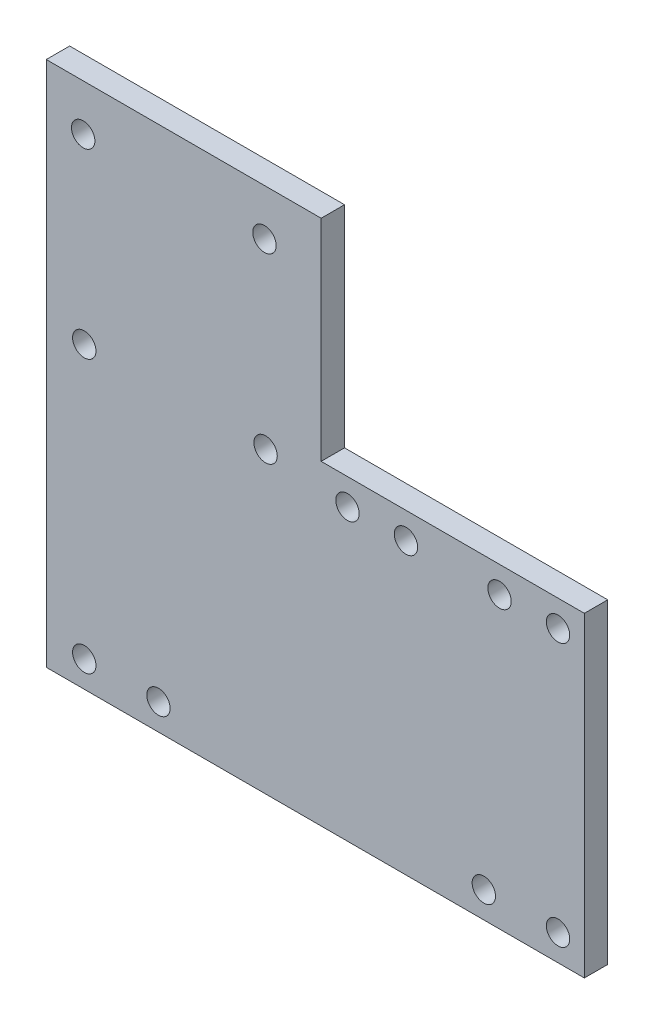
ISO-10303-21;
HEADER;
FILE_DESCRIPTION(('STEP AP214'),'2;1');
FILE_NAME('part.step','',(''),(''),'','','');
FILE_SCHEMA(('AUTOMOTIVE_DESIGN { 1 0 10303 214 1 1 1 1 }'));
ENDSEC;
DATA;
#1=APPLICATION_CONTEXT('core data for automotive mechanical design processes');
#2=APPLICATION_PROTOCOL_DEFINITION('international standard','automotive_design',2000,#1);
#3=PRODUCT_CONTEXT('',#1,'mechanical');
#4=PRODUCT('Part','Part','',(#3));
#5=PRODUCT_RELATED_PRODUCT_CATEGORY('part','',(#4));
#6=PRODUCT_DEFINITION_FORMATION('','',#4);
#7=PRODUCT_DEFINITION_CONTEXT('part definition',#1,'design');
#8=PRODUCT_DEFINITION('design','',#6,#7);
#9=PRODUCT_DEFINITION_SHAPE('','',#8);
#10=(LENGTH_UNIT() NAMED_UNIT(*) SI_UNIT(.MILLI.,.METRE.));
#11=(NAMED_UNIT(*) PLANE_ANGLE_UNIT() SI_UNIT($,.RADIAN.));
#12=(NAMED_UNIT(*) SI_UNIT($,.STERADIAN.) SOLID_ANGLE_UNIT());
#13=UNCERTAINTY_MEASURE_WITH_UNIT(LENGTH_MEASURE(1.E-05),#10,'distance_accuracy_value','');
#14=(GEOMETRIC_REPRESENTATION_CONTEXT(3) GLOBAL_UNCERTAINTY_ASSIGNED_CONTEXT((#13)) GLOBAL_UNIT_ASSIGNED_CONTEXT((#10,
#11,#12)) REPRESENTATION_CONTEXT('',''));
#15=CARTESIAN_POINT('',(0.,0.,0.));
#16=DIRECTION('',(0.,0.,1.));
#17=DIRECTION('',(1.,0.,0.));
#18=AXIS2_PLACEMENT_3D('',#15,#16,#17);
#19=CARTESIAN_POINT('',(45.,-27.,4.));
#20=DIRECTION('',(-1.,0.,0.));
#21=DIRECTION('',(0.,0.,1.));
#22=AXIS2_PLACEMENT_3D('',#19,#20,#21);
#23=PLANE('',#22);
#24=DIRECTION('',(0.,1.,0.));
#25=VECTOR('',#24,1.);
#26=CARTESIAN_POINT('',(45.,-27.,0.));
#27=LINE('',#26,#25);
#28=CARTESIAN_POINT('',(45.,-27.,0.));
#29=VERTEX_POINT('',#28);
#30=CARTESIAN_POINT('',(45.,27.,0.));
#31=VERTEX_POINT('',#30);
#32=EDGE_CURVE('E181',#29,#31,#27,.T.);
#33=ORIENTED_EDGE('',*,*,#32,.T.);
#34=DIRECTION('',(0.,0.,-1.));
#35=VECTOR('',#34,1.);
#36=CARTESIAN_POINT('',(45.,27.,4.));
#37=LINE('',#36,#35);
#38=CARTESIAN_POINT('',(45.,27.,4.));
#39=VERTEX_POINT('',#38);
#40=EDGE_CURVE('E11',#39,#31,#37,.T.);
#41=ORIENTED_EDGE('',*,*,#40,.F.);
#42=DIRECTION('',(0.,1.,0.));
#43=VECTOR('',#42,1.);
#44=CARTESIAN_POINT('',(45.,-27.,4.));
#45=LINE('',#44,#43);
#46=CARTESIAN_POINT('',(45.,-27.,4.));
#47=VERTEX_POINT('',#46);
#48=EDGE_CURVE('E184',#47,#39,#45,.T.);
#49=ORIENTED_EDGE('',*,*,#48,.F.);
#50=DIRECTION('',(0.,0.,-1.));
#51=VECTOR('',#50,1.);
#52=CARTESIAN_POINT('',(45.,-27.,4.));
#53=LINE('',#52,#51);
#54=EDGE_CURVE('E192',#47,#29,#53,.T.);
#55=ORIENTED_EDGE('',*,*,#54,.T.);
#56=EDGE_LOOP('',(#33,#41,#49,#55));
#57=FACE_BOUND('',#56,.T.);
#58=ADVANCED_FACE('F33',(#57),#23,.F.);
#59=CARTESIAN_POINT('',(0.,27.,4.));
#60=DIRECTION('',(0.,-1.,0.));
#61=DIRECTION('',(0.,0.,-1.));
#62=AXIS2_PLACEMENT_3D('',#59,#60,#61);
#63=PLANE('',#62);
#64=DIRECTION('',(-1.,0.,0.));
#65=VECTOR('',#64,1.);
#66=CARTESIAN_POINT('',(0.,27.,0.));
#67=LINE('',#66,#65);
#68=CARTESIAN_POINT('',(0.,27.,0.));
#69=VERTEX_POINT('',#68);
#70=EDGE_CURVE('E195',#31,#69,#67,.T.);
#71=ORIENTED_EDGE('',*,*,#70,.T.);
#72=DIRECTION('',(0.,0.,-1.));
#73=VECTOR('',#72,1.);
#74=CARTESIAN_POINT('',(0.,27.,4.));
#75=LINE('',#74,#73);
#76=CARTESIAN_POINT('',(0.,27.,4.));
#77=VERTEX_POINT('',#76);
#78=EDGE_CURVE('E41',#77,#69,#75,.T.);
#79=ORIENTED_EDGE('',*,*,#78,.F.);
#80=DIRECTION('',(-1.,0.,0.));
#81=VECTOR('',#80,1.);
#82=CARTESIAN_POINT('',(0.,27.,4.));
#83=LINE('',#82,#81);
#84=EDGE_CURVE('E82',#39,#77,#83,.T.);
#85=ORIENTED_EDGE('',*,*,#84,.F.);
#86=ORIENTED_EDGE('',*,*,#40,.T.);
#87=EDGE_LOOP('',(#71,#79,#85,#86));
#88=FACE_BOUND('',#87,.T.);
#89=ADVANCED_FACE('F203',(#88),#63,.F.);
#90=CARTESIAN_POINT('',(0.,63.,4.));
#91=DIRECTION('',(-1.,0.,0.));
#92=DIRECTION('',(0.,-1.,0.));
#93=AXIS2_PLACEMENT_3D('',#90,#91,#92);
#94=PLANE('',#93);
#95=DIRECTION('',(0.,1.,0.));
#96=VECTOR('',#95,1.);
#97=CARTESIAN_POINT('',(0.,63.,0.));
#98=LINE('',#97,#96);
#99=CARTESIAN_POINT('',(0.,63.,0.));
#100=VERTEX_POINT('',#99);
#101=EDGE_CURVE('E68',#69,#100,#98,.T.);
#102=ORIENTED_EDGE('',*,*,#101,.T.);
#103=DIRECTION('',(0.,0.,-1.));
#104=VECTOR('',#103,1.);
#105=CARTESIAN_POINT('',(0.,63.,4.));
#106=LINE('',#105,#104);
#107=CARTESIAN_POINT('',(0.,63.,4.));
#108=VERTEX_POINT('',#107);
#109=EDGE_CURVE('E101',#108,#100,#106,.T.);
#110=ORIENTED_EDGE('',*,*,#109,.F.);
#111=DIRECTION('',(0.,1.,0.));
#112=VECTOR('',#111,1.);
#113=CARTESIAN_POINT('',(0.,63.,4.));
#114=LINE('',#113,#112);
#115=EDGE_CURVE('E187',#77,#108,#114,.T.);
#116=ORIENTED_EDGE('',*,*,#115,.F.);
#117=ORIENTED_EDGE('',*,*,#78,.T.);
#118=EDGE_LOOP('',(#102,#110,#116,#117));
#119=FACE_BOUND('',#118,.T.);
#120=ADVANCED_FACE('F201',(#119),#94,.F.);
#121=CARTESIAN_POINT('',(-45.,63.,4.));
#122=DIRECTION('',(0.,-1.,0.));
#123=DIRECTION('',(0.,0.,-1.));
#124=AXIS2_PLACEMENT_3D('',#121,#122,#123);
#125=PLANE('',#124);
#126=DIRECTION('',(-1.,0.,0.));
#127=VECTOR('',#126,1.);
#128=CARTESIAN_POINT('',(-45.,63.,0.));
#129=LINE('',#128,#127);
#130=CARTESIAN_POINT('',(-47.,63.,0.));
#131=VERTEX_POINT('',#130);
#132=EDGE_CURVE('E95',#100,#131,#129,.T.);
#133=ORIENTED_EDGE('',*,*,#132,.T.);
#134=DIRECTION('',(0.,0.,1.));
#135=VECTOR('',#134,1.);
#136=CARTESIAN_POINT('',(-47.,63.,0.));
#137=LINE('',#136,#135);
#138=CARTESIAN_POINT('',(-47.,63.,4.));
#139=VERTEX_POINT('',#138);
#140=EDGE_CURVE('E99',#131,#139,#137,.T.);
#141=ORIENTED_EDGE('',*,*,#140,.T.);
#142=DIRECTION('',(-1.,0.,0.));
#143=VECTOR('',#142,1.);
#144=CARTESIAN_POINT('',(-45.,63.,4.));
#145=LINE('',#144,#143);
#146=EDGE_CURVE('E189',#108,#139,#145,.T.);
#147=ORIENTED_EDGE('',*,*,#146,.F.);
#148=ORIENTED_EDGE('',*,*,#109,.T.);
#149=EDGE_LOOP('',(#133,#141,#147,#148));
#150=FACE_BOUND('',#149,.T.);
#151=ADVANCED_FACE('F97',(#150),#125,.F.);
#152=CARTESIAN_POINT('',(-45.,-27.,4.));
#153=DIRECTION('',(0.,1.,0.));
#154=DIRECTION('',(0.,0.,1.));
#155=AXIS2_PLACEMENT_3D('',#152,#153,#154);
#156=PLANE('',#155);
#157=DIRECTION('',(1.,0.,0.));
#158=VECTOR('',#157,1.);
#159=CARTESIAN_POINT('',(-45.,-27.,0.));
#160=LINE('',#159,#158);
#161=CARTESIAN_POINT('',(-47.,-27.,0.));
#162=VERTEX_POINT('',#161);
#163=EDGE_CURVE('E75',#162,#29,#160,.T.);
#164=ORIENTED_EDGE('',*,*,#163,.T.);
#165=ORIENTED_EDGE('',*,*,#54,.F.);
#166=DIRECTION('',(1.,0.,0.));
#167=VECTOR('',#166,1.);
#168=CARTESIAN_POINT('',(-45.,-27.,4.));
#169=LINE('',#168,#167);
#170=CARTESIAN_POINT('',(-47.,-27.,4.));
#171=VERTEX_POINT('',#170);
#172=EDGE_CURVE('E49',#171,#47,#169,.T.);
#173=ORIENTED_EDGE('',*,*,#172,.F.);
#174=DIRECTION('',(0.,0.,1.));
#175=VECTOR('',#174,1.);
#176=CARTESIAN_POINT('',(-47.,-27.,0.));
#177=LINE('',#176,#175);
#178=EDGE_CURVE('E111',#162,#171,#177,.T.);
#179=ORIENTED_EDGE('',*,*,#178,.F.);
#180=EDGE_LOOP('',(#164,#165,#173,#179));
#181=FACE_BOUND('',#180,.T.);
#182=ADVANCED_FACE('F206',(#181),#156,.F.);
#183=CARTESIAN_POINT('',(0.,0.,4.));
#184=DIRECTION('',(0.,0.,-1.));
#185=DIRECTION('',(-1.,0.,0.));
#186=AXIS2_PLACEMENT_3D('',#183,#184,#185);
#187=PLANE('',#186);
#188=CARTESIAN_POINT('',(14.5,22.5,4.));
#189=DIRECTION('',(0.,0.,1.));
#190=DIRECTION('',(1.,0.,0.));
#191=AXIS2_PLACEMENT_3D('',#188,#189,#190);
#192=CIRCLE('',#191,2.);
#193=CARTESIAN_POINT('',(16.5,22.5,4.));
#194=VERTEX_POINT('',#193);
#195=EDGE_CURVE('E461',#194,#194,#192,.T.);
#196=ORIENTED_EDGE('',*,*,#195,.F.);
#197=EDGE_LOOP('',(#196));
#198=FACE_BOUND('',#197,.T.);
#199=CARTESIAN_POINT('',(4.50000000000001,22.5,4.));
#200=DIRECTION('',(0.,0.,1.));
#201=DIRECTION('',(1.,0.,0.));
#202=AXIS2_PLACEMENT_3D('',#199,#200,#201);
#203=CIRCLE('',#202,2.);
#204=CARTESIAN_POINT('',(6.50000000000002,22.5,4.));
#205=VERTEX_POINT('',#204);
#206=EDGE_CURVE('E119',#205,#205,#203,.T.);
#207=ORIENTED_EDGE('',*,*,#206,.F.);
#208=EDGE_LOOP('',(#207));
#209=FACE_BOUND('',#208,.T.);
#210=CARTESIAN_POINT('',(-9.69083877229573,55.0808500842383,4.));
#211=DIRECTION('',(0.,0.,1.));
#212=DIRECTION('',(1.,0.,0.));
#213=AXIS2_PLACEMENT_3D('',#210,#211,#212);
#214=CIRCLE('',#213,2.);
#215=CARTESIAN_POINT('',(-7.69083877229573,55.0808500842383,4.));
#216=VERTEX_POINT('',#215);
#217=EDGE_CURVE('E122',#216,#216,#214,.T.);
#218=ORIENTED_EDGE('',*,*,#217,.F.);
#219=EDGE_LOOP('',(#218));
#220=FACE_BOUND('',#219,.T.);
#221=CARTESIAN_POINT('',(-40.6908387722957,55.0808500842383,4.));
#222=DIRECTION('',(0.,0.,1.));
#223=DIRECTION('',(1.,0.,0.));
#224=AXIS2_PLACEMENT_3D('',#221,#222,#223);
#225=CIRCLE('',#224,2.);
#226=CARTESIAN_POINT('',(-38.6908387722957,55.0808500842383,4.));
#227=VERTEX_POINT('',#226);
#228=EDGE_CURVE('E127',#227,#227,#225,.T.);
#229=ORIENTED_EDGE('',*,*,#228,.F.);
#230=EDGE_LOOP('',(#229));
#231=FACE_BOUND('',#230,.T.);
#232=CARTESIAN_POINT('',(-9.50003460700268,24.0345291066058,4.));
#233=DIRECTION('',(0.,0.,1.));
#234=DIRECTION('',(1.,0.,0.));
#235=AXIS2_PLACEMENT_3D('',#232,#233,#234);
#236=CIRCLE('',#235,2.00000000000001);
#237=CARTESIAN_POINT('',(-7.50003460700267,24.0345291066058,4.));
#238=VERTEX_POINT('',#237);
#239=EDGE_CURVE('E133',#238,#238,#236,.T.);
#240=ORIENTED_EDGE('',*,*,#239,.F.);
#241=EDGE_LOOP('',(#240));
#242=FACE_BOUND('',#241,.T.);
#243=CARTESIAN_POINT('',(-40.5,24.0808500842383,4.));
#244=DIRECTION('',(0.,0.,1.));
#245=DIRECTION('',(1.,0.,0.));
#246=AXIS2_PLACEMENT_3D('',#243,#244,#245);
#247=CIRCLE('',#246,2.);
#248=CARTESIAN_POINT('',(-38.5,24.0808500842383,4.));
#249=VERTEX_POINT('',#248);
#250=EDGE_CURVE('E139',#249,#249,#247,.T.);
#251=ORIENTED_EDGE('',*,*,#250,.F.);
#252=EDGE_LOOP('',(#251));
#253=FACE_BOUND('',#252,.T.);
#254=CARTESIAN_POINT('',(40.5,22.5,4.));
#255=DIRECTION('',(0.,0.,1.));
#256=DIRECTION('',(-1.,0.,0.));
#257=AXIS2_PLACEMENT_3D('',#254,#255,#256);
#258=CIRCLE('',#257,2.);
#259=CARTESIAN_POINT('',(38.5,22.5,4.));
#260=VERTEX_POINT('',#259);
#261=EDGE_CURVE('E145',#260,#260,#258,.T.);
#262=ORIENTED_EDGE('',*,*,#261,.F.);
#263=EDGE_LOOP('',(#262));
#264=FACE_BOUND('',#263,.T.);
#265=CARTESIAN_POINT('',(30.5,22.5,4.));
#266=DIRECTION('',(0.,0.,1.));
#267=DIRECTION('',(-1.,0.,0.));
#268=AXIS2_PLACEMENT_3D('',#265,#266,#267);
#269=CIRCLE('',#268,2.);
#270=CARTESIAN_POINT('',(28.5,22.5,4.));
#271=VERTEX_POINT('',#270);
#272=EDGE_CURVE('E158',#271,#271,#269,.T.);
#273=ORIENTED_EDGE('',*,*,#272,.F.);
#274=EDGE_LOOP('',(#273));
#275=FACE_BOUND('',#274,.T.);
#276=CARTESIAN_POINT('',(40.5,-22.5,4.));
#277=DIRECTION('',(0.,0.,1.));
#278=DIRECTION('',(-1.,0.,0.));
#279=AXIS2_PLACEMENT_3D('',#276,#277,#278);
#280=CIRCLE('',#279,2.);
#281=CARTESIAN_POINT('',(38.5,-22.5,4.));
#282=VERTEX_POINT('',#281);
#283=EDGE_CURVE('E152',#282,#282,#280,.T.);
#284=ORIENTED_EDGE('',*,*,#283,.F.);
#285=EDGE_LOOP('',(#284));
#286=FACE_BOUND('',#285,.T.);
#287=CARTESIAN_POINT('',(27.8166373293287,-22.5,4.));
#288=DIRECTION('',(0.,0.,1.));
#289=DIRECTION('',(-1.,0.,0.));
#290=AXIS2_PLACEMENT_3D('',#287,#288,#289);
#291=CIRCLE('',#290,2.);
#292=CARTESIAN_POINT('',(25.8166373293287,-22.5,4.));
#293=VERTEX_POINT('',#292);
#294=EDGE_CURVE('E151',#293,#293,#291,.T.);
#295=ORIENTED_EDGE('',*,*,#294,.F.);
#296=EDGE_LOOP('',(#295));
#297=FACE_BOUND('',#296,.T.);
#298=CARTESIAN_POINT('',(-27.8166373293287,-22.5,4.));
#299=DIRECTION('',(0.,0.,1.));
#300=DIRECTION('',(1.,0.,0.));
#301=AXIS2_PLACEMENT_3D('',#298,#299,#300);
#302=CIRCLE('',#301,2.);
#303=CARTESIAN_POINT('',(-25.8166373293287,-22.5,4.));
#304=VERTEX_POINT('',#303);
#305=EDGE_CURVE('E170',#304,#304,#302,.T.);
#306=ORIENTED_EDGE('',*,*,#305,.F.);
#307=EDGE_LOOP('',(#306));
#308=FACE_BOUND('',#307,.T.);
#309=CARTESIAN_POINT('',(-40.5,-22.5,4.));
#310=DIRECTION('',(0.,0.,1.));
#311=DIRECTION('',(1.,0.,0.));
#312=AXIS2_PLACEMENT_3D('',#309,#310,#311);
#313=CIRCLE('',#312,2.);
#314=CARTESIAN_POINT('',(-38.5,-22.5,4.));
#315=VERTEX_POINT('',#314);
#316=EDGE_CURVE('E169',#315,#315,#313,.T.);
#317=ORIENTED_EDGE('',*,*,#316,.F.);
#318=EDGE_LOOP('',(#317));
#319=FACE_BOUND('',#318,.T.);
#320=ORIENTED_EDGE('',*,*,#48,.T.);
#321=ORIENTED_EDGE('',*,*,#84,.T.);
#322=ORIENTED_EDGE('',*,*,#115,.T.);
#323=ORIENTED_EDGE('',*,*,#146,.T.);
#324=DIRECTION('',(0.,-1.,0.));
#325=VECTOR('',#324,1.);
#326=CARTESIAN_POINT('',(-47.,63.,4.));
#327=LINE('',#326,#325);
#328=EDGE_CURVE('E110',#139,#171,#327,.T.);
#329=ORIENTED_EDGE('',*,*,#328,.T.);
#330=ORIENTED_EDGE('',*,*,#172,.T.);
#331=EDGE_LOOP('',(#320,#321,#322,#323,#329,#330));
#332=FACE_BOUND('',#331,.T.);
#333=ADVANCED_FACE('F207',(#198,#209,#220,#231,#242,#253,#264,#275,#286,#297,#308,#319,#332),
#187,.F.);
#334=CARTESIAN_POINT('',(0.,0.,0.));
#335=DIRECTION('',(0.,0.,-1.));
#336=DIRECTION('',(-1.,0.,0.));
#337=AXIS2_PLACEMENT_3D('',#334,#335,#336);
#338=PLANE('',#337);
#339=CARTESIAN_POINT('',(14.5,22.5,0.));
#340=DIRECTION('',(0.,0.,1.));
#341=DIRECTION('',(1.,0.,0.));
#342=AXIS2_PLACEMENT_3D('',#339,#340,#341);
#343=CIRCLE('',#342,2.);
#344=CARTESIAN_POINT('',(16.5,22.5,0.));
#345=VERTEX_POINT('',#344);
#346=EDGE_CURVE('E459',#345,#345,#343,.T.);
#347=ORIENTED_EDGE('',*,*,#346,.T.);
#348=EDGE_LOOP('',(#347));
#349=FACE_BOUND('',#348,.T.);
#350=CARTESIAN_POINT('',(4.50000000000001,22.5,0.));
#351=DIRECTION('',(0.,0.,1.));
#352=DIRECTION('',(1.,0.,0.));
#353=AXIS2_PLACEMENT_3D('',#350,#351,#352);
#354=CIRCLE('',#353,2.);
#355=CARTESIAN_POINT('',(6.50000000000002,22.5,0.));
#356=VERTEX_POINT('',#355);
#357=EDGE_CURVE('E116',#356,#356,#354,.T.);
#358=ORIENTED_EDGE('',*,*,#357,.T.);
#359=EDGE_LOOP('',(#358));
#360=FACE_BOUND('',#359,.T.);
#361=CARTESIAN_POINT('',(-9.69083877229573,55.0808500842383,0.));
#362=DIRECTION('',(0.,0.,1.));
#363=DIRECTION('',(1.,0.,0.));
#364=AXIS2_PLACEMENT_3D('',#361,#362,#363);
#365=CIRCLE('',#364,2.);
#366=CARTESIAN_POINT('',(-7.69083877229573,55.0808500842383,0.));
#367=VERTEX_POINT('',#366);
#368=EDGE_CURVE('E124',#367,#367,#365,.T.);
#369=ORIENTED_EDGE('',*,*,#368,.T.);
#370=EDGE_LOOP('',(#369));
#371=FACE_BOUND('',#370,.T.);
#372=CARTESIAN_POINT('',(-40.6908387722957,55.0808500842383,0.));
#373=DIRECTION('',(0.,0.,1.));
#374=DIRECTION('',(1.,0.,0.));
#375=AXIS2_PLACEMENT_3D('',#372,#373,#374);
#376=CIRCLE('',#375,2.);
#377=CARTESIAN_POINT('',(-38.6908387722957,55.0808500842383,0.));
#378=VERTEX_POINT('',#377);
#379=EDGE_CURVE('E130',#378,#378,#376,.T.);
#380=ORIENTED_EDGE('',*,*,#379,.T.);
#381=EDGE_LOOP('',(#380));
#382=FACE_BOUND('',#381,.T.);
#383=CARTESIAN_POINT('',(-9.50003460700268,24.0345291066058,0.));
#384=DIRECTION('',(0.,0.,1.));
#385=DIRECTION('',(1.,0.,0.));
#386=AXIS2_PLACEMENT_3D('',#383,#384,#385);
#387=CIRCLE('',#386,2.00000000000001);
#388=CARTESIAN_POINT('',(-7.50003460700267,24.0345291066058,0.));
#389=VERTEX_POINT('',#388);
#390=EDGE_CURVE('E136',#389,#389,#387,.T.);
#391=ORIENTED_EDGE('',*,*,#390,.T.);
#392=EDGE_LOOP('',(#391));
#393=FACE_BOUND('',#392,.T.);
#394=CARTESIAN_POINT('',(-40.5,24.0808500842383,0.));
#395=DIRECTION('',(0.,0.,1.));
#396=DIRECTION('',(1.,0.,0.));
#397=AXIS2_PLACEMENT_3D('',#394,#395,#396);
#398=CIRCLE('',#397,2.);
#399=CARTESIAN_POINT('',(-38.5,24.0808500842383,0.));
#400=VERTEX_POINT('',#399);
#401=EDGE_CURVE('E142',#400,#400,#398,.T.);
#402=ORIENTED_EDGE('',*,*,#401,.T.);
#403=EDGE_LOOP('',(#402));
#404=FACE_BOUND('',#403,.T.);
#405=CARTESIAN_POINT('',(40.5,22.5,0.));
#406=DIRECTION('',(0.,0.,1.));
#407=DIRECTION('',(-1.,0.,0.));
#408=AXIS2_PLACEMENT_3D('',#405,#406,#407);
#409=CIRCLE('',#408,2.);
#410=CARTESIAN_POINT('',(38.5,22.5,0.));
#411=VERTEX_POINT('',#410);
#412=EDGE_CURVE('E161',#411,#411,#409,.T.);
#413=ORIENTED_EDGE('',*,*,#412,.T.);
#414=EDGE_LOOP('',(#413));
#415=FACE_BOUND('',#414,.T.);
#416=CARTESIAN_POINT('',(30.5,22.5,0.));
#417=DIRECTION('',(0.,0.,1.));
#418=DIRECTION('',(-1.,0.,0.));
#419=AXIS2_PLACEMENT_3D('',#416,#417,#418);
#420=CIRCLE('',#419,2.);
#421=CARTESIAN_POINT('',(28.5,22.5,0.));
#422=VERTEX_POINT('',#421);
#423=EDGE_CURVE('E155',#422,#422,#420,.T.);
#424=ORIENTED_EDGE('',*,*,#423,.T.);
#425=EDGE_LOOP('',(#424));
#426=FACE_BOUND('',#425,.T.);
#427=CARTESIAN_POINT('',(40.5,-22.5,0.));
#428=DIRECTION('',(0.,0.,1.));
#429=DIRECTION('',(-1.,0.,0.));
#430=AXIS2_PLACEMENT_3D('',#427,#428,#429);
#431=CIRCLE('',#430,2.);
#432=CARTESIAN_POINT('',(38.5,-22.5,0.));
#433=VERTEX_POINT('',#432);
#434=EDGE_CURVE('E148',#433,#433,#431,.T.);
#435=ORIENTED_EDGE('',*,*,#434,.T.);
#436=EDGE_LOOP('',(#435));
#437=FACE_BOUND('',#436,.T.);
#438=CARTESIAN_POINT('',(27.8166373293287,-22.5,0.));
#439=DIRECTION('',(0.,0.,1.));
#440=DIRECTION('',(-1.,0.,0.));
#441=AXIS2_PLACEMENT_3D('',#438,#439,#440);
#442=CIRCLE('',#441,2.);
#443=CARTESIAN_POINT('',(25.8166373293287,-22.5,0.));
#444=VERTEX_POINT('',#443);
#445=EDGE_CURVE('E173',#444,#444,#442,.T.);
#446=ORIENTED_EDGE('',*,*,#445,.T.);
#447=EDGE_LOOP('',(#446));
#448=FACE_BOUND('',#447,.T.);
#449=CARTESIAN_POINT('',(-27.8166373293287,-22.5,0.));
#450=DIRECTION('',(0.,0.,1.));
#451=DIRECTION('',(1.,0.,0.));
#452=AXIS2_PLACEMENT_3D('',#449,#450,#451);
#453=CIRCLE('',#452,2.);
#454=CARTESIAN_POINT('',(-25.8166373293287,-22.5,0.));
#455=VERTEX_POINT('',#454);
#456=EDGE_CURVE('E166',#455,#455,#453,.T.);
#457=ORIENTED_EDGE('',*,*,#456,.T.);
#458=EDGE_LOOP('',(#457));
#459=FACE_BOUND('',#458,.T.);
#460=CARTESIAN_POINT('',(-40.5,-22.5,0.));
#461=DIRECTION('',(0.,0.,1.));
#462=DIRECTION('',(1.,0.,0.));
#463=AXIS2_PLACEMENT_3D('',#460,#461,#462);
#464=CIRCLE('',#463,2.);
#465=CARTESIAN_POINT('',(-38.5,-22.5,0.));
#466=VERTEX_POINT('',#465);
#467=EDGE_CURVE('E178',#466,#466,#464,.T.);
#468=ORIENTED_EDGE('',*,*,#467,.T.);
#469=EDGE_LOOP('',(#468));
#470=FACE_BOUND('',#469,.T.);
#471=ORIENTED_EDGE('',*,*,#32,.F.);
#472=ORIENTED_EDGE('',*,*,#163,.F.);
#473=DIRECTION('',(0.,-1.,0.));
#474=VECTOR('',#473,1.);
#475=CARTESIAN_POINT('',(-47.,63.,0.));
#476=LINE('',#475,#474);
#477=EDGE_CURVE('E109',#131,#162,#476,.T.);
#478=ORIENTED_EDGE('',*,*,#477,.F.);
#479=ORIENTED_EDGE('',*,*,#132,.F.);
#480=ORIENTED_EDGE('',*,*,#101,.F.);
#481=ORIENTED_EDGE('',*,*,#70,.F.);
#482=EDGE_LOOP('',(#471,#472,#478,#479,#480,#481));
#483=FACE_BOUND('',#482,.T.);
#484=ADVANCED_FACE('F114',(#349,#360,#371,#382,#393,#404,#415,#426,#437,#448,#459,#470,#483),
#338,.T.);
#485=CARTESIAN_POINT('',(-40.5,-22.5,0.));
#486=DIRECTION('',(0.,0.,1.));
#487=DIRECTION('',(1.,0.,0.));
#488=AXIS2_PLACEMENT_3D('',#485,#486,#487);
#489=CYLINDRICAL_SURFACE('',#488,2.);
#490=ORIENTED_EDGE('',*,*,#467,.F.);
#491=EDGE_LOOP('',(#490));
#492=FACE_BOUND('',#491,.T.);
#493=ORIENTED_EDGE('',*,*,#316,.T.);
#494=EDGE_LOOP('',(#493));
#495=FACE_BOUND('',#494,.T.);
#496=ADVANCED_FACE('F215',(#492,#495),#489,.F.);
#497=CARTESIAN_POINT('',(-27.8166373293287,-22.5,0.));
#498=DIRECTION('',(0.,0.,1.));
#499=DIRECTION('',(1.,0.,0.));
#500=AXIS2_PLACEMENT_3D('',#497,#498,#499);
#501=CYLINDRICAL_SURFACE('',#500,2.);
#502=ORIENTED_EDGE('',*,*,#456,.F.);
#503=EDGE_LOOP('',(#502));
#504=FACE_BOUND('',#503,.T.);
#505=ORIENTED_EDGE('',*,*,#305,.T.);
#506=EDGE_LOOP('',(#505));
#507=FACE_BOUND('',#506,.T.);
#508=ADVANCED_FACE('F319',(#504,#507),#501,.F.);
#509=CARTESIAN_POINT('',(27.8166373293287,-22.5,0.));
#510=DIRECTION('',(0.,0.,1.));
#511=DIRECTION('',(1.,0.,0.));
#512=AXIS2_PLACEMENT_3D('',#509,#510,#511);
#513=CYLINDRICAL_SURFACE('',#512,2.);
#514=ORIENTED_EDGE('',*,*,#445,.F.);
#515=EDGE_LOOP('',(#514));
#516=FACE_BOUND('',#515,.T.);
#517=ORIENTED_EDGE('',*,*,#294,.T.);
#518=EDGE_LOOP('',(#517));
#519=FACE_BOUND('',#518,.T.);
#520=ADVANCED_FACE('F311',(#516,#519),#513,.F.);
#521=CARTESIAN_POINT('',(40.5,-22.5,0.));
#522=DIRECTION('',(0.,0.,1.));
#523=DIRECTION('',(1.,0.,0.));
#524=AXIS2_PLACEMENT_3D('',#521,#522,#523);
#525=CYLINDRICAL_SURFACE('',#524,2.);
#526=ORIENTED_EDGE('',*,*,#434,.F.);
#527=EDGE_LOOP('',(#526));
#528=FACE_BOUND('',#527,.T.);
#529=ORIENTED_EDGE('',*,*,#283,.T.);
#530=EDGE_LOOP('',(#529));
#531=FACE_BOUND('',#530,.T.);
#532=ADVANCED_FACE('F307',(#528,#531),#525,.F.);
#533=CARTESIAN_POINT('',(30.5,22.5,0.));
#534=DIRECTION('',(0.,0.,1.));
#535=DIRECTION('',(1.,0.,0.));
#536=AXIS2_PLACEMENT_3D('',#533,#534,#535);
#537=CYLINDRICAL_SURFACE('',#536,2.);
#538=ORIENTED_EDGE('',*,*,#423,.F.);
#539=EDGE_LOOP('',(#538));
#540=FACE_BOUND('',#539,.T.);
#541=ORIENTED_EDGE('',*,*,#272,.T.);
#542=EDGE_LOOP('',(#541));
#543=FACE_BOUND('',#542,.T.);
#544=ADVANCED_FACE('F310',(#540,#543),#537,.F.);
#545=CARTESIAN_POINT('',(40.5,22.5,0.));
#546=DIRECTION('',(0.,0.,1.));
#547=DIRECTION('',(1.,0.,0.));
#548=AXIS2_PLACEMENT_3D('',#545,#546,#547);
#549=CYLINDRICAL_SURFACE('',#548,2.);
#550=ORIENTED_EDGE('',*,*,#412,.F.);
#551=EDGE_LOOP('',(#550));
#552=FACE_BOUND('',#551,.T.);
#553=ORIENTED_EDGE('',*,*,#261,.T.);
#554=EDGE_LOOP('',(#553));
#555=FACE_BOUND('',#554,.T.);
#556=ADVANCED_FACE('F305',(#552,#555),#549,.F.);
#557=CARTESIAN_POINT('',(-40.5,24.0808500842383,0.));
#558=DIRECTION('',(0.,0.,1.));
#559=DIRECTION('',(1.,0.,0.));
#560=AXIS2_PLACEMENT_3D('',#557,#558,#559);
#561=CYLINDRICAL_SURFACE('',#560,2.);
#562=ORIENTED_EDGE('',*,*,#401,.F.);
#563=EDGE_LOOP('',(#562));
#564=FACE_BOUND('',#563,.T.);
#565=ORIENTED_EDGE('',*,*,#250,.T.);
#566=EDGE_LOOP('',(#565));
#567=FACE_BOUND('',#566,.T.);
#568=ADVANCED_FACE('F301',(#564,#567),#561,.F.);
#569=CARTESIAN_POINT('',(-9.50003460700268,24.0345291066058,0.));
#570=DIRECTION('',(0.,0.,1.));
#571=DIRECTION('',(1.,0.,0.));
#572=AXIS2_PLACEMENT_3D('',#569,#570,#571);
#573=CYLINDRICAL_SURFACE('',#572,2.00000000000001);
#574=ORIENTED_EDGE('',*,*,#390,.F.);
#575=EDGE_LOOP('',(#574));
#576=FACE_BOUND('',#575,.T.);
#577=ORIENTED_EDGE('',*,*,#239,.T.);
#578=EDGE_LOOP('',(#577));
#579=FACE_BOUND('',#578,.T.);
#580=ADVANCED_FACE('F297',(#576,#579),#573,.F.);
#581=CARTESIAN_POINT('',(-40.6908387722957,55.0808500842383,0.));
#582=DIRECTION('',(0.,0.,1.));
#583=DIRECTION('',(1.,0.,0.));
#584=AXIS2_PLACEMENT_3D('',#581,#582,#583);
#585=CYLINDRICAL_SURFACE('',#584,2.);
#586=ORIENTED_EDGE('',*,*,#379,.F.);
#587=EDGE_LOOP('',(#586));
#588=FACE_BOUND('',#587,.T.);
#589=ORIENTED_EDGE('',*,*,#228,.T.);
#590=EDGE_LOOP('',(#589));
#591=FACE_BOUND('',#590,.T.);
#592=ADVANCED_FACE('F293',(#588,#591),#585,.F.);
#593=CARTESIAN_POINT('',(-9.69083877229573,55.0808500842383,0.));
#594=DIRECTION('',(0.,0.,1.));
#595=DIRECTION('',(1.,0.,0.));
#596=AXIS2_PLACEMENT_3D('',#593,#594,#595);
#597=CYLINDRICAL_SURFACE('',#596,2.);
#598=ORIENTED_EDGE('',*,*,#368,.F.);
#599=EDGE_LOOP('',(#598));
#600=FACE_BOUND('',#599,.T.);
#601=ORIENTED_EDGE('',*,*,#217,.T.);
#602=EDGE_LOOP('',(#601));
#603=FACE_BOUND('',#602,.T.);
#604=ADVANCED_FACE('F252',(#600,#603),#597,.F.);
#605=CARTESIAN_POINT('',(-47.,63.,0.));
#606=DIRECTION('',(-1.,0.,0.));
#607=DIRECTION('',(0.,-1.,0.));
#608=AXIS2_PLACEMENT_3D('',#605,#606,#607);
#609=PLANE('',#608);
#610=ORIENTED_EDGE('',*,*,#328,.F.);
#611=ORIENTED_EDGE('',*,*,#140,.F.);
#612=ORIENTED_EDGE('',*,*,#477,.T.);
#613=ORIENTED_EDGE('',*,*,#178,.T.);
#614=EDGE_LOOP('',(#610,#611,#612,#613));
#615=FACE_BOUND('',#614,.T.);
#616=ADVANCED_FACE('F107',(#615),#609,.T.);
#617=CARTESIAN_POINT('',(4.50000000000001,22.5,0.));
#618=DIRECTION('',(0.,0.,1.));
#619=DIRECTION('',(1.,0.,0.));
#620=AXIS2_PLACEMENT_3D('',#617,#618,#619);
#621=CYLINDRICAL_SURFACE('',#620,2.);
#622=ORIENTED_EDGE('',*,*,#357,.F.);
#623=EDGE_LOOP('',(#622));
#624=FACE_BOUND('',#623,.T.);
#625=ORIENTED_EDGE('',*,*,#206,.T.);
#626=EDGE_LOOP('',(#625));
#627=FACE_BOUND('',#626,.T.);
#628=ADVANCED_FACE('F251',(#624,#627),#621,.F.);
#629=CARTESIAN_POINT('',(14.5,22.5,0.));
#630=DIRECTION('',(0.,0.,1.));
#631=DIRECTION('',(1.,0.,0.));
#632=AXIS2_PLACEMENT_3D('',#629,#630,#631);
#633=CYLINDRICAL_SURFACE('',#632,2.);
#634=ORIENTED_EDGE('',*,*,#346,.F.);
#635=EDGE_LOOP('',(#634));
#636=FACE_BOUND('',#635,.T.);
#637=ORIENTED_EDGE('',*,*,#195,.T.);
#638=EDGE_LOOP('',(#637));
#639=FACE_BOUND('',#638,.T.);
#640=ADVANCED_FACE('F275',(#636,#639),#633,.F.);
#641=CLOSED_SHELL('',(#58,#89,#120,#151,#182,#333,#484,#496,#508,#520,#532,#544,#556,#568,#580,
#592,#604,#616,#628,#640));
#642=MANIFOLD_SOLID_BREP('B2',#641);
#643=ADVANCED_BREP_SHAPE_REPRESENTATION('',(#18,#642),#14);
#644=SHAPE_DEFINITION_REPRESENTATION(#9,#643);
ENDSEC;
END-ISO-10303-21;
